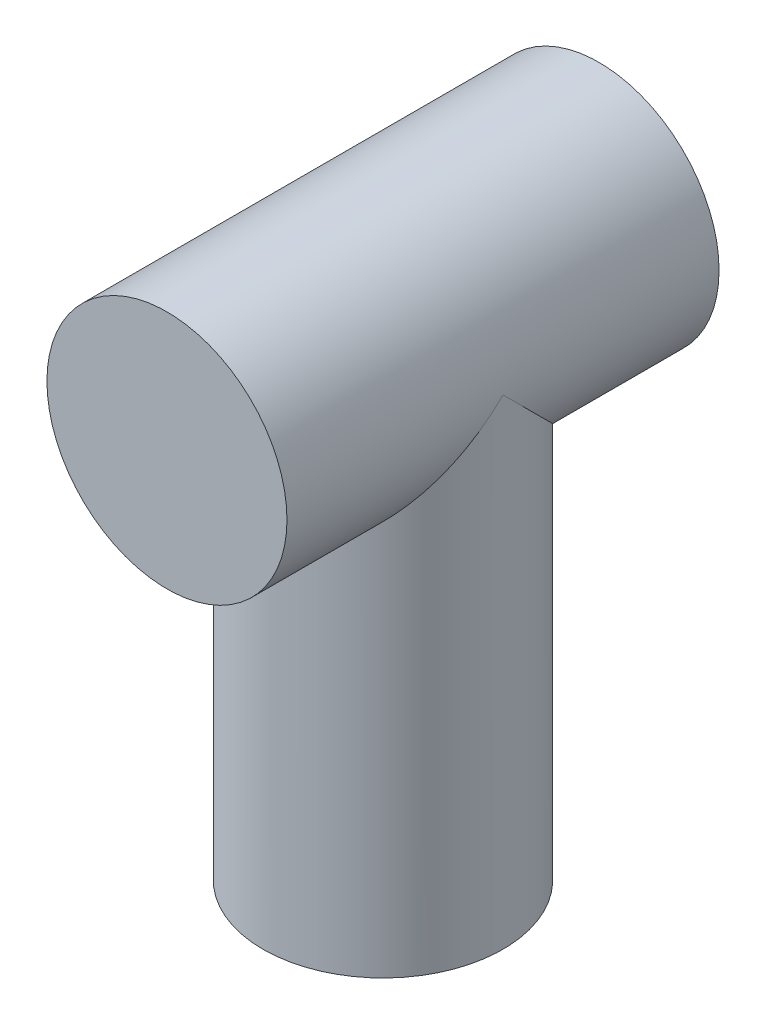
ISO-10303-21;
HEADER;
FILE_DESCRIPTION(('STEP AP214'),'2;1');
FILE_NAME('part.step','',(''),(''),'','','');
FILE_SCHEMA(('AUTOMOTIVE_DESIGN { 1 0 10303 214 1 1 1 1 }'));
ENDSEC;
DATA;
#1=APPLICATION_CONTEXT('core data for automotive mechanical design processes');
#2=APPLICATION_PROTOCOL_DEFINITION('international standard','automotive_design',2000,#1);
#3=PRODUCT_CONTEXT('',#1,'mechanical');
#4=PRODUCT('Part','Part','',(#3));
#5=PRODUCT_RELATED_PRODUCT_CATEGORY('part','',(#4));
#6=PRODUCT_DEFINITION_FORMATION('','',#4);
#7=PRODUCT_DEFINITION_CONTEXT('part definition',#1,'design');
#8=PRODUCT_DEFINITION('design','',#6,#7);
#9=PRODUCT_DEFINITION_SHAPE('','',#8);
#10=(LENGTH_UNIT() NAMED_UNIT(*) SI_UNIT(.MILLI.,.METRE.));
#11=(NAMED_UNIT(*) PLANE_ANGLE_UNIT() SI_UNIT($,.RADIAN.));
#12=(NAMED_UNIT(*) SI_UNIT($,.STERADIAN.) SOLID_ANGLE_UNIT());
#13=UNCERTAINTY_MEASURE_WITH_UNIT(LENGTH_MEASURE(1.E-05),#10,'distance_accuracy_value','');
#14=(GEOMETRIC_REPRESENTATION_CONTEXT(3) GLOBAL_UNCERTAINTY_ASSIGNED_CONTEXT((#13)) GLOBAL_UNIT_ASSIGNED_CONTEXT((#10,
#11,#12)) REPRESENTATION_CONTEXT('',''));
#15=CARTESIAN_POINT('',(0.,0.,0.));
#16=DIRECTION('',(0.,0.,1.));
#17=DIRECTION('',(1.,0.,0.));
#18=AXIS2_PLACEMENT_3D('',#15,#16,#17);
#19=CARTESIAN_POINT('',(0.,0.,22.5));
#20=DIRECTION('',(0.,0.,-1.));
#21=DIRECTION('',(-1.,0.,0.));
#22=AXIS2_PLACEMENT_3D('',#19,#20,#21);
#23=CYLINDRICAL_SURFACE('',#22,12.5);
#24=CARTESIAN_POINT('',(0.,0.,0.));
#25=DIRECTION('',(0.,-0.707106781186548,-0.707106781186547));
#26=DIRECTION('',(0.,0.707106781186548,-0.707106781186547));
#27=AXIS2_PLACEMENT_3D('',#24,#25,#26);
#28=ELLIPSE('',#27,17.6776695296637,12.5);
#29=CARTESIAN_POINT('',(-12.5,0.,0.));
#30=VERTEX_POINT('',#29);
#31=CARTESIAN_POINT('',(12.5,0.,0.));
#32=VERTEX_POINT('',#31);
#33=EDGE_CURVE('E42',#30,#32,#28,.F.);
#34=ORIENTED_EDGE('',*,*,#33,.T.);
#35=CARTESIAN_POINT('',(0.,0.,0.));
#36=DIRECTION('',(0.,0.707106781186548,-0.707106781186547));
#37=DIRECTION('',(0.,-0.707106781186548,-0.707106781186547));
#38=AXIS2_PLACEMENT_3D('',#35,#36,#37);
#39=ELLIPSE('',#38,17.6776695296637,12.5);
#40=EDGE_CURVE('E11',#32,#30,#39,.T.);
#41=ORIENTED_EDGE('',*,*,#40,.T.);
#42=EDGE_LOOP('',(#34,#41));
#43=FACE_BOUND('',#42,.T.);
#44=CARTESIAN_POINT('',(0.,0.,22.5));
#45=DIRECTION('',(0.,0.,1.));
#46=DIRECTION('',(1.,0.,0.));
#47=AXIS2_PLACEMENT_3D('',#44,#45,#46);
#48=CIRCLE('',#47,12.5);
#49=CARTESIAN_POINT('',(12.5,0.,22.5));
#50=VERTEX_POINT('',#49);
#51=EDGE_CURVE('E50',#50,#50,#48,.T.);
#52=ORIENTED_EDGE('',*,*,#51,.F.);
#53=EDGE_LOOP('',(#52));
#54=FACE_BOUND('',#53,.T.);
#55=CARTESIAN_POINT('',(0.,0.,-22.5));
#56=DIRECTION('',(0.,0.,1.));
#57=DIRECTION('',(1.,0.,0.));
#58=AXIS2_PLACEMENT_3D('',#55,#56,#57);
#59=CIRCLE('',#58,12.5);
#60=CARTESIAN_POINT('',(12.5,0.,-22.5));
#61=VERTEX_POINT('',#60);
#62=EDGE_CURVE('E59',#61,#61,#59,.T.);
#63=ORIENTED_EDGE('',*,*,#62,.T.);
#64=EDGE_LOOP('',(#63));
#65=FACE_BOUND('',#64,.T.);
#66=ADVANCED_FACE('F35',(#43,#54,#65),#23,.T.);
#67=CARTESIAN_POINT('',(0.,0.,22.5));
#68=DIRECTION('',(0.,0.,1.));
#69=DIRECTION('',(1.,0.,0.));
#70=AXIS2_PLACEMENT_3D('',#67,#68,#69);
#71=PLANE('',#70);
#72=ORIENTED_EDGE('',*,*,#51,.T.);
#73=EDGE_LOOP('',(#72));
#74=FACE_BOUND('',#73,.T.);
#75=ADVANCED_FACE('F53',(#74),#71,.T.);
#76=CARTESIAN_POINT('',(0.,0.,-22.5));
#77=DIRECTION('',(0.,0.,1.));
#78=DIRECTION('',(1.,0.,0.));
#79=AXIS2_PLACEMENT_3D('',#76,#77,#78);
#80=PLANE('',#79);
#81=ORIENTED_EDGE('',*,*,#62,.F.);
#82=EDGE_LOOP('',(#81));
#83=FACE_BOUND('',#82,.T.);
#84=ADVANCED_FACE('F75',(#83),#80,.F.);
#85=CARTESIAN_POINT('',(0.,-50.,0.));
#86=DIRECTION('',(0.,1.,0.));
#87=DIRECTION('',(0.,0.,1.));
#88=AXIS2_PLACEMENT_3D('',#85,#86,#87);
#89=CYLINDRICAL_SURFACE('',#88,12.5);
#90=CARTESIAN_POINT('',(0.,-50.,0.));
#91=DIRECTION('',(0.,1.,0.));
#92=DIRECTION('',(0.,0.,1.));
#93=AXIS2_PLACEMENT_3D('',#90,#91,#92);
#94=CIRCLE('',#93,12.5);
#95=CARTESIAN_POINT('',(0.,-50.,12.5));
#96=VERTEX_POINT('',#95);
#97=EDGE_CURVE('E61',#96,#96,#94,.T.);
#98=ORIENTED_EDGE('',*,*,#97,.T.);
#99=EDGE_LOOP('',(#98));
#100=FACE_BOUND('',#99,.T.);
#101=ORIENTED_EDGE('',*,*,#40,.F.);
#102=ORIENTED_EDGE('',*,*,#33,.F.);
#103=EDGE_LOOP('',(#101,#102));
#104=FACE_BOUND('',#103,.T.);
#105=ADVANCED_FACE('F48',(#100,#104),#89,.T.);
#106=CARTESIAN_POINT('',(0.,-50.,0.));
#107=DIRECTION('',(0.,1.,0.));
#108=DIRECTION('',(0.,0.,1.));
#109=AXIS2_PLACEMENT_3D('',#106,#107,#108);
#110=PLANE('',#109);
#111=ORIENTED_EDGE('',*,*,#97,.F.);
#112=EDGE_LOOP('',(#111));
#113=FACE_BOUND('',#112,.T.);
#114=ADVANCED_FACE('F69',(#113),#110,.F.);
#115=CLOSED_SHELL('',(#66,#75,#84,#105,#114));
#116=MANIFOLD_SOLID_BREP('B2',#115);
#117=ADVANCED_BREP_SHAPE_REPRESENTATION('',(#18,#116),#14);
#118=SHAPE_DEFINITION_REPRESENTATION(#9,#117);
ENDSEC;
END-ISO-10303-21;
